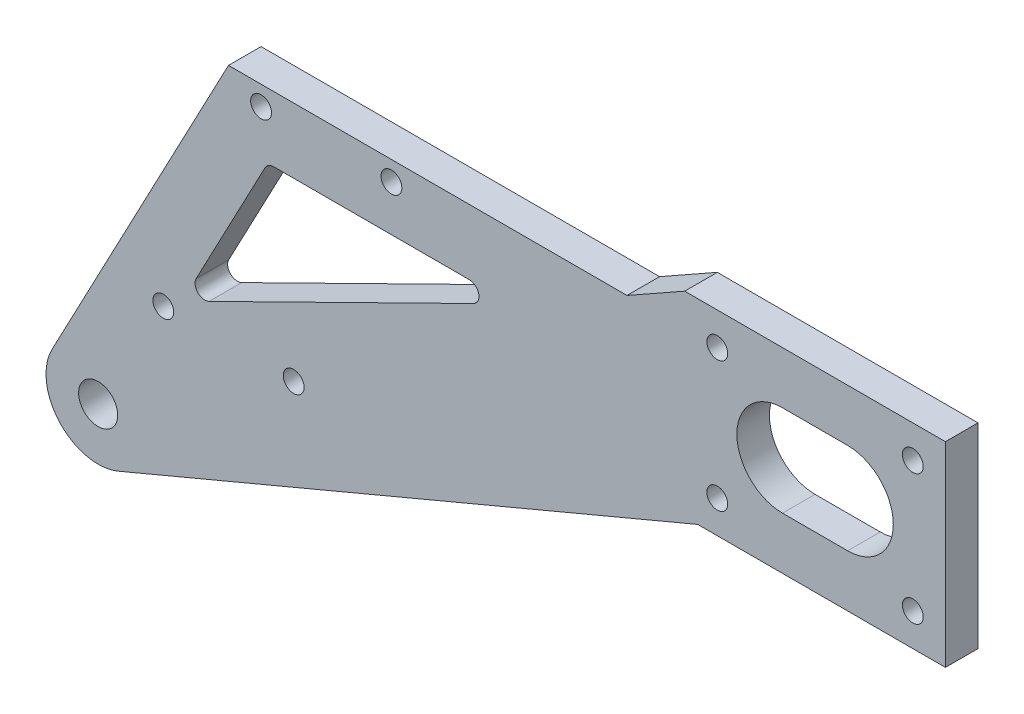
ISO-10303-21;
HEADER;
FILE_DESCRIPTION(('STEP AP214'),'2;1');
FILE_NAME('part.step','',(''),(''),'','','');
FILE_SCHEMA(('AUTOMOTIVE_DESIGN { 1 0 10303 214 1 1 1 1 }'));
ENDSEC;
DATA;
#1=APPLICATION_CONTEXT('core data for automotive mechanical design processes');
#2=APPLICATION_PROTOCOL_DEFINITION('international standard','automotive_design',2000,#1);
#3=PRODUCT_CONTEXT('',#1,'mechanical');
#4=PRODUCT('Part','Part','',(#3));
#5=PRODUCT_RELATED_PRODUCT_CATEGORY('part','',(#4));
#6=PRODUCT_DEFINITION_FORMATION('','',#4);
#7=PRODUCT_DEFINITION_CONTEXT('part definition',#1,'design');
#8=PRODUCT_DEFINITION('design','',#6,#7);
#9=PRODUCT_DEFINITION_SHAPE('','',#8);
#10=(LENGTH_UNIT() NAMED_UNIT(*) SI_UNIT(.MILLI.,.METRE.));
#11=(NAMED_UNIT(*) PLANE_ANGLE_UNIT() SI_UNIT($,.RADIAN.));
#12=(NAMED_UNIT(*) SI_UNIT($,.STERADIAN.) SOLID_ANGLE_UNIT());
#13=UNCERTAINTY_MEASURE_WITH_UNIT(LENGTH_MEASURE(1.E-05),#10,'distance_accuracy_value','');
#14=(GEOMETRIC_REPRESENTATION_CONTEXT(3) GLOBAL_UNCERTAINTY_ASSIGNED_CONTEXT((#13)) GLOBAL_UNIT_ASSIGNED_CONTEXT((#10,
#11,#12)) REPRESENTATION_CONTEXT('',''));
#15=CARTESIAN_POINT('',(0.,0.,0.));
#16=DIRECTION('',(0.,0.,1.));
#17=DIRECTION('',(1.,0.,0.));
#18=AXIS2_PLACEMENT_3D('',#15,#16,#17);
#19=CARTESIAN_POINT('',(0.,0.,5.));
#20=DIRECTION('',(0.,0.,1.));
#21=DIRECTION('',(1.,0.,0.));
#22=AXIS2_PLACEMENT_3D('',#19,#20,#21);
#23=PLANE('',#22);
#24=CARTESIAN_POINT('',(10.,18.,5.));
#25=DIRECTION('',(0.,0.,1.));
#26=DIRECTION('',(1.,0.,0.));
#27=AXIS2_PLACEMENT_3D('',#24,#25,#26);
#28=CIRCLE('',#27,1.6);
#29=CARTESIAN_POINT('',(11.6,18.,5.));
#30=VERTEX_POINT('',#29);
#31=EDGE_CURVE('E485',#30,#30,#28,.T.);
#32=ORIENTED_EDGE('',*,*,#31,.F.);
#33=EDGE_LOOP('',(#32));
#34=FACE_BOUND('',#33,.T.);
#35=CARTESIAN_POINT('',(30.,18.,5.));
#36=DIRECTION('',(0.,0.,1.));
#37=DIRECTION('',(1.,0.,0.));
#38=AXIS2_PLACEMENT_3D('',#35,#36,#37);
#39=CIRCLE('',#38,1.6);
#40=CARTESIAN_POINT('',(31.6,18.,5.));
#41=VERTEX_POINT('',#40);
#42=EDGE_CURVE('E192',#41,#41,#39,.T.);
#43=ORIENTED_EDGE('',*,*,#42,.F.);
#44=EDGE_LOOP('',(#43));
#45=FACE_BOUND('',#44,.T.);
#46=CARTESIAN_POINT('',(56.9317860296705,43.5,5.));
#47=DIRECTION('',(0.,0.,1.));
#48=DIRECTION('',(1.,0.,0.));
#49=AXIS2_PLACEMENT_3D('',#46,#47,#48);
#50=CIRCLE('',#49,1.50000000000001);
#51=CARTESIAN_POINT('',(57.5951320607567,42.1546479854543,5.));
#52=VERTEX_POINT('',#51);
#53=CARTESIAN_POINT('',(56.9317860296705,45.,5.));
#54=VERTEX_POINT('',#53);
#55=EDGE_CURVE('E54',#52,#54,#50,.T.);
#56=ORIENTED_EDGE('',*,*,#55,.F.);
#57=DIRECTION('',(0.896901343030464,0.442230687390812,0.));
#58=VECTOR('',#57,1.);
#59=CARTESIAN_POINT('',(17.0325312009098,22.1546479854543,5.));
#60=LINE('',#59,#58);
#61=CARTESIAN_POINT('',(17.0325312009098,22.1546479854543,5.));
#62=VERTEX_POINT('',#61);
#63=EDGE_CURVE('E186',#62,#52,#60,.T.);
#64=ORIENTED_EDGE('',*,*,#63,.F.);
#65=CARTESIAN_POINT('',(16.3691851698236,23.5,5.));
#66=DIRECTION('',(0.,0.,1.));
#67=DIRECTION('',(1.,0.,0.));
#68=AXIS2_PLACEMENT_3D('',#65,#66,#67);
#69=CIRCLE('',#68,1.5);
#70=CARTESIAN_POINT('',(15.0428009644484,24.2005033474091,5.));
#71=VERTEX_POINT('',#70);
#72=EDGE_CURVE('E189',#71,#62,#69,.T.);
#73=ORIENTED_EDGE('',*,*,#72,.F.);
#74=DIRECTION('',(-0.46700223160609,-0.884256136916748,0.));
#75=VECTOR('',#74,1.);
#76=CARTESIAN_POINT('',(25.6054018242954,44.2005033474091,5.));
#77=LINE('',#76,#75);
#78=CARTESIAN_POINT('',(25.6054018242954,44.2005033474091,5.));
#79=VERTEX_POINT('',#78);
#80=EDGE_CURVE('E209',#79,#71,#77,.T.);
#81=ORIENTED_EDGE('',*,*,#80,.F.);
#82=CARTESIAN_POINT('',(26.9317860296705,43.5,5.));
#83=DIRECTION('',(0.,0.,1.));
#84=DIRECTION('',(-1.,0.,0.));
#85=AXIS2_PLACEMENT_3D('',#82,#83,#84);
#86=CIRCLE('',#85,1.5);
#87=CARTESIAN_POINT('',(26.9317860296705,45.,5.));
#88=VERTEX_POINT('',#87);
#89=EDGE_CURVE('E206',#88,#79,#86,.T.);
#90=ORIENTED_EDGE('',*,*,#89,.F.);
#91=DIRECTION('',(-1.,0.,0.));
#92=VECTOR('',#91,1.);
#93=CARTESIAN_POINT('',(56.9317860296705,45.,5.));
#94=LINE('',#93,#92);
#95=EDGE_CURVE('E203',#54,#88,#94,.T.);
#96=ORIENTED_EDGE('',*,*,#95,.F.);
#97=EDGE_LOOP('',(#56,#64,#73,#81,#90,#96));
#98=FACE_BOUND('',#97,.T.);
#99=CARTESIAN_POINT('',(105.,45.,5.));
#100=DIRECTION('',(0.,0.,1.));
#101=DIRECTION('',(1.,0.,0.));
#102=AXIS2_PLACEMENT_3D('',#99,#100,#101);
#103=CIRCLE('',#102,7.);
#104=CARTESIAN_POINT('',(105.,52.,5.));
#105=VERTEX_POINT('',#104);
#106=CARTESIAN_POINT('',(105.,38.,5.));
#107=VERTEX_POINT('',#106);
#108=EDGE_CURVE('E62',#105,#107,#103,.T.);
#109=ORIENTED_EDGE('',*,*,#108,.F.);
#110=DIRECTION('',(-1.,0.,0.));
#111=VECTOR('',#110,1.);
#112=CARTESIAN_POINT('',(105.,52.,5.));
#113=LINE('',#112,#111);
#114=CARTESIAN_POINT('',(115.,52.,5.));
#115=VERTEX_POINT('',#114);
#116=EDGE_CURVE('E228',#115,#105,#113,.T.);
#117=ORIENTED_EDGE('',*,*,#116,.F.);
#118=CARTESIAN_POINT('',(115.,45.,5.));
#119=DIRECTION('',(0.,0.,1.));
#120=DIRECTION('',(1.,0.,0.));
#121=AXIS2_PLACEMENT_3D('',#118,#119,#120);
#122=CIRCLE('',#121,7.);
#123=CARTESIAN_POINT('',(115.,38.,5.));
#124=VERTEX_POINT('',#123);
#125=EDGE_CURVE('E243',#124,#115,#122,.T.);
#126=ORIENTED_EDGE('',*,*,#125,.F.);
#127=DIRECTION('',(1.,0.,0.));
#128=VECTOR('',#127,1.);
#129=CARTESIAN_POINT('',(105.,38.,5.));
#130=LINE('',#129,#128);
#131=EDGE_CURVE('E239',#107,#124,#130,.T.);
#132=ORIENTED_EDGE('',*,*,#131,.F.);
#133=EDGE_LOOP('',(#109,#117,#126,#132));
#134=FACE_BOUND('',#133,.T.);
#135=DIRECTION('',(-0.46700223160609,-0.884256136916748,0.));
#136=VECTOR('',#135,1.);
#137=CARTESIAN_POINT('',(-7.07404909533399,3.73601785284872,5.));
#138=LINE('',#137,#136);
#139=CARTESIAN_POINT('',(20.,55.,5.));
#140=VERTEX_POINT('',#139);
#141=CARTESIAN_POINT('',(-7.07404909533399,3.73601785284872,5.));
#142=VERTEX_POINT('',#141);
#143=EDGE_CURVE('E216',#140,#142,#138,.T.);
#144=ORIENTED_EDGE('',*,*,#143,.T.);
#145=CARTESIAN_POINT('',(0.,0.,5.));
#146=DIRECTION('',(0.,0.,1.));
#147=DIRECTION('',(1.,0.,0.));
#148=AXIS2_PLACEMENT_3D('',#145,#146,#147);
#149=CIRCLE('',#148,8.);
#150=CARTESIAN_POINT('',(3.10046580802895,-7.37476181128878,5.));
#151=VERTEX_POINT('',#150);
#152=EDGE_CURVE('E314',#142,#151,#149,.T.);
#153=ORIENTED_EDGE('',*,*,#152,.T.);
#154=DIRECTION('',(0.921845226411098,0.387558226003619,0.));
#155=VECTOR('',#154,1.);
#156=CARTESIAN_POINT('',(92.,30.,5.));
#157=LINE('',#156,#155);
#158=CARTESIAN_POINT('',(92.,30.,5.));
#159=VERTEX_POINT('',#158);
#160=EDGE_CURVE('E316',#151,#159,#157,.T.);
#161=ORIENTED_EDGE('',*,*,#160,.T.);
#162=DIRECTION('',(1.,0.,0.));
#163=VECTOR('',#162,1.);
#164=CARTESIAN_POINT('',(92.,30.,5.));
#165=LINE('',#164,#163);
#166=CARTESIAN_POINT('',(130.,30.,5.));
#167=VERTEX_POINT('',#166);
#168=EDGE_CURVE('E319',#159,#167,#165,.T.);
#169=ORIENTED_EDGE('',*,*,#168,.T.);
#170=DIRECTION('',(0.,1.,0.));
#171=VECTOR('',#170,1.);
#172=CARTESIAN_POINT('',(130.,60.,5.));
#173=LINE('',#172,#171);
#174=CARTESIAN_POINT('',(130.,60.,5.));
#175=VERTEX_POINT('',#174);
#176=EDGE_CURVE('E321',#167,#175,#173,.T.);
#177=ORIENTED_EDGE('',*,*,#176,.T.);
#178=DIRECTION('',(-1.,0.,0.));
#179=VECTOR('',#178,1.);
#180=CARTESIAN_POINT('',(90.,60.,5.));
#181=LINE('',#180,#179);
#182=CARTESIAN_POINT('',(90.,60.,5.));
#183=VERTEX_POINT('',#182);
#184=EDGE_CURVE('E323',#175,#183,#181,.T.);
#185=ORIENTED_EDGE('',*,*,#184,.T.);
#186=DIRECTION('',(-0.870797121650983,-0.4916425255451,0.));
#187=VECTOR('',#186,1.);
#188=CARTESIAN_POINT('',(-3.9331402043608,6.96637697320786,5.));
#189=LINE('',#188,#187);
#190=CARTESIAN_POINT('',(81.1440012162749,55.,5.));
#191=VERTEX_POINT('',#190);
#192=EDGE_CURVE('E325',#183,#191,#189,.T.);
#193=ORIENTED_EDGE('',*,*,#192,.T.);
#194=DIRECTION('',(-1.,0.,0.));
#195=VECTOR('',#194,1.);
#196=CARTESIAN_POINT('',(81.1440012162749,55.,5.));
#197=LINE('',#196,#195);
#198=EDGE_CURVE('E264',#191,#140,#197,.T.);
#199=ORIENTED_EDGE('',*,*,#198,.T.);
#200=EDGE_LOOP('',(#144,#153,#161,#169,#177,#185,#193,#199));
#201=FACE_BOUND('',#200,.T.);
#202=CARTESIAN_POINT('',(25.,52.,5.));
#203=DIRECTION('',(0.,0.,1.));
#204=DIRECTION('',(1.,0.,0.));
#205=AXIS2_PLACEMENT_3D('',#202,#203,#204);
#206=CIRCLE('',#205,1.6);
#207=CARTESIAN_POINT('',(26.6,52.,5.));
#208=VERTEX_POINT('',#207);
#209=EDGE_CURVE('E265',#208,#208,#206,.T.);
#210=ORIENTED_EDGE('',*,*,#209,.F.);
#211=EDGE_LOOP('',(#210));
#212=FACE_BOUND('',#211,.T.);
#213=CARTESIAN_POINT('',(45.,52.,5.));
#214=DIRECTION('',(0.,0.,1.));
#215=DIRECTION('',(1.,0.,0.));
#216=AXIS2_PLACEMENT_3D('',#213,#214,#215);
#217=CIRCLE('',#216,1.6);
#218=CARTESIAN_POINT('',(46.6,52.,5.));
#219=VERTEX_POINT('',#218);
#220=EDGE_CURVE('E256',#219,#219,#217,.T.);
#221=ORIENTED_EDGE('',*,*,#220,.F.);
#222=EDGE_LOOP('',(#221));
#223=FACE_BOUND('',#222,.T.);
#224=CARTESIAN_POINT('',(125.,35.,5.));
#225=DIRECTION('',(0.,0.,1.));
#226=DIRECTION('',(1.,0.,0.));
#227=AXIS2_PLACEMENT_3D('',#224,#225,#226);
#228=CIRCLE('',#227,1.59999999999999);
#229=CARTESIAN_POINT('',(126.6,35.,5.));
#230=VERTEX_POINT('',#229);
#231=EDGE_CURVE('E290',#230,#230,#228,.T.);
#232=ORIENTED_EDGE('',*,*,#231,.F.);
#233=EDGE_LOOP('',(#232));
#234=FACE_BOUND('',#233,.T.);
#235=CARTESIAN_POINT('',(125.,55.,5.));
#236=DIRECTION('',(0.,0.,1.));
#237=DIRECTION('',(1.,0.,0.));
#238=AXIS2_PLACEMENT_3D('',#235,#236,#237);
#239=CIRCLE('',#238,1.59999999999999);
#240=CARTESIAN_POINT('',(126.6,55.,5.));
#241=VERTEX_POINT('',#240);
#242=EDGE_CURVE('E302',#241,#241,#239,.T.);
#243=ORIENTED_EDGE('',*,*,#242,.F.);
#244=EDGE_LOOP('',(#243));
#245=FACE_BOUND('',#244,.T.);
#246=CARTESIAN_POINT('',(0.,0.,5.));
#247=DIRECTION('',(0.,0.,1.));
#248=DIRECTION('',(1.,0.,0.));
#249=AXIS2_PLACEMENT_3D('',#246,#247,#248);
#250=CIRCLE('',#249,3.);
#251=CARTESIAN_POINT('',(3.,0.,5.));
#252=VERTEX_POINT('',#251);
#253=EDGE_CURVE('E308',#252,#252,#250,.T.);
#254=ORIENTED_EDGE('',*,*,#253,.F.);
#255=EDGE_LOOP('',(#254));
#256=FACE_BOUND('',#255,.T.);
#257=CARTESIAN_POINT('',(95.,55.,5.));
#258=DIRECTION('',(0.,0.,1.));
#259=DIRECTION('',(1.,0.,0.));
#260=AXIS2_PLACEMENT_3D('',#257,#258,#259);
#261=CIRCLE('',#260,1.60000000000001);
#262=CARTESIAN_POINT('',(96.6,55.,5.));
#263=VERTEX_POINT('',#262);
#264=EDGE_CURVE('E296',#263,#263,#261,.T.);
#265=ORIENTED_EDGE('',*,*,#264,.F.);
#266=EDGE_LOOP('',(#265));
#267=FACE_BOUND('',#266,.T.);
#268=CARTESIAN_POINT('',(95.,35.,5.));
#269=DIRECTION('',(0.,0.,1.));
#270=DIRECTION('',(1.,0.,0.));
#271=AXIS2_PLACEMENT_3D('',#268,#269,#270);
#272=CIRCLE('',#271,1.60000000000001);
#273=CARTESIAN_POINT('',(96.6,35.,5.));
#274=VERTEX_POINT('',#273);
#275=EDGE_CURVE('E284',#274,#274,#272,.T.);
#276=ORIENTED_EDGE('',*,*,#275,.F.);
#277=EDGE_LOOP('',(#276));
#278=FACE_BOUND('',#277,.T.);
#279=ADVANCED_FACE('F39',(#34,#45,#98,#134,#201,#212,#223,#234,#245,#256,#267,#278),#23,.T.);
#280=CARTESIAN_POINT('',(0.,0.,0.));
#281=DIRECTION('',(0.,0.,1.));
#282=DIRECTION('',(1.,0.,0.));
#283=AXIS2_PLACEMENT_3D('',#280,#281,#282);
#284=PLANE('',#283);
#285=CARTESIAN_POINT('',(10.,18.,0.));
#286=DIRECTION('',(0.,0.,1.));
#287=DIRECTION('',(1.,0.,0.));
#288=AXIS2_PLACEMENT_3D('',#285,#286,#287);
#289=CIRCLE('',#288,1.6);
#290=CARTESIAN_POINT('',(11.6,18.,0.));
#291=VERTEX_POINT('',#290);
#292=EDGE_CURVE('E240',#291,#291,#289,.T.);
#293=ORIENTED_EDGE('',*,*,#292,.T.);
#294=EDGE_LOOP('',(#293));
#295=FACE_BOUND('',#294,.T.);
#296=CARTESIAN_POINT('',(30.,18.,0.));
#297=DIRECTION('',(0.,0.,1.));
#298=DIRECTION('',(1.,0.,0.));
#299=AXIS2_PLACEMENT_3D('',#296,#297,#298);
#300=CIRCLE('',#299,1.6);
#301=CARTESIAN_POINT('',(31.6,18.,0.));
#302=VERTEX_POINT('',#301);
#303=EDGE_CURVE('E486',#302,#302,#300,.T.);
#304=ORIENTED_EDGE('',*,*,#303,.T.);
#305=EDGE_LOOP('',(#304));
#306=FACE_BOUND('',#305,.T.);
#307=DIRECTION('',(0.896901343030464,0.442230687390812,0.));
#308=VECTOR('',#307,1.);
#309=CARTESIAN_POINT('',(17.0325312009098,22.1546479854543,0.));
#310=LINE('',#309,#308);
#311=CARTESIAN_POINT('',(17.0325312009098,22.1546479854543,0.));
#312=VERTEX_POINT('',#311);
#313=CARTESIAN_POINT('',(57.5951320607567,42.1546479854543,0.));
#314=VERTEX_POINT('',#313);
#315=EDGE_CURVE('E172',#312,#314,#310,.T.);
#316=ORIENTED_EDGE('',*,*,#315,.T.);
#317=CARTESIAN_POINT('',(56.9317860296705,43.5,0.));
#318=DIRECTION('',(0.,0.,1.));
#319=DIRECTION('',(1.,0.,0.));
#320=AXIS2_PLACEMENT_3D('',#317,#318,#319);
#321=CIRCLE('',#320,1.50000000000001);
#322=CARTESIAN_POINT('',(56.9317860296705,45.,0.));
#323=VERTEX_POINT('',#322);
#324=EDGE_CURVE('E166',#314,#323,#321,.T.);
#325=ORIENTED_EDGE('',*,*,#324,.T.);
#326=DIRECTION('',(-1.,0.,0.));
#327=VECTOR('',#326,1.);
#328=CARTESIAN_POINT('',(56.9317860296705,45.,0.));
#329=LINE('',#328,#327);
#330=CARTESIAN_POINT('',(26.9317860296705,45.,0.));
#331=VERTEX_POINT('',#330);
#332=EDGE_CURVE('E176',#323,#331,#329,.T.);
#333=ORIENTED_EDGE('',*,*,#332,.T.);
#334=CARTESIAN_POINT('',(26.9317860296705,43.5,0.));
#335=DIRECTION('',(0.,0.,1.));
#336=DIRECTION('',(-1.,0.,0.));
#337=AXIS2_PLACEMENT_3D('',#334,#335,#336);
#338=CIRCLE('',#337,1.5);
#339=CARTESIAN_POINT('',(25.6054018242954,44.2005033474091,0.));
#340=VERTEX_POINT('',#339);
#341=EDGE_CURVE('E180',#331,#340,#338,.T.);
#342=ORIENTED_EDGE('',*,*,#341,.T.);
#343=DIRECTION('',(-0.46700223160609,-0.884256136916748,0.));
#344=VECTOR('',#343,1.);
#345=CARTESIAN_POINT('',(25.6054018242954,44.2005033474091,0.));
#346=LINE('',#345,#344);
#347=CARTESIAN_POINT('',(15.0428009644484,24.2005033474091,0.));
#348=VERTEX_POINT('',#347);
#349=EDGE_CURVE('E196',#340,#348,#346,.T.);
#350=ORIENTED_EDGE('',*,*,#349,.T.);
#351=CARTESIAN_POINT('',(16.3691851698236,23.5,0.));
#352=DIRECTION('',(0.,0.,1.));
#353=DIRECTION('',(1.,0.,0.));
#354=AXIS2_PLACEMENT_3D('',#351,#352,#353);
#355=CIRCLE('',#354,1.5);
#356=EDGE_CURVE('E199',#348,#312,#355,.T.);
#357=ORIENTED_EDGE('',*,*,#356,.T.);
#358=EDGE_LOOP('',(#316,#325,#333,#342,#350,#357));
#359=FACE_BOUND('',#358,.T.);
#360=DIRECTION('',(-1.,0.,0.));
#361=VECTOR('',#360,1.);
#362=CARTESIAN_POINT('',(105.,52.,0.));
#363=LINE('',#362,#361);
#364=CARTESIAN_POINT('',(115.,52.,0.));
#365=VERTEX_POINT('',#364);
#366=CARTESIAN_POINT('',(105.,52.,0.));
#367=VERTEX_POINT('',#366);
#368=EDGE_CURVE('E234',#365,#367,#363,.T.);
#369=ORIENTED_EDGE('',*,*,#368,.T.);
#370=CARTESIAN_POINT('',(105.,45.,0.));
#371=DIRECTION('',(0.,0.,1.));
#372=DIRECTION('',(1.,0.,0.));
#373=AXIS2_PLACEMENT_3D('',#370,#371,#372);
#374=CIRCLE('',#373,7.);
#375=CARTESIAN_POINT('',(105.,38.,0.));
#376=VERTEX_POINT('',#375);
#377=EDGE_CURVE('E224',#367,#376,#374,.T.);
#378=ORIENTED_EDGE('',*,*,#377,.T.);
#379=DIRECTION('',(1.,0.,0.));
#380=VECTOR('',#379,1.);
#381=CARTESIAN_POINT('',(105.,38.,0.));
#382=LINE('',#381,#380);
#383=CARTESIAN_POINT('',(115.,38.,0.));
#384=VERTEX_POINT('',#383);
#385=EDGE_CURVE('E227',#376,#384,#382,.T.);
#386=ORIENTED_EDGE('',*,*,#385,.T.);
#387=CARTESIAN_POINT('',(115.,45.,0.));
#388=DIRECTION('',(0.,0.,1.));
#389=DIRECTION('',(1.,0.,0.));
#390=AXIS2_PLACEMENT_3D('',#387,#388,#389);
#391=CIRCLE('',#390,7.);
#392=EDGE_CURVE('E231',#384,#365,#391,.T.);
#393=ORIENTED_EDGE('',*,*,#392,.T.);
#394=EDGE_LOOP('',(#369,#378,#386,#393));
#395=FACE_BOUND('',#394,.T.);
#396=CARTESIAN_POINT('',(0.,0.,0.));
#397=DIRECTION('',(0.,0.,1.));
#398=DIRECTION('',(1.,0.,0.));
#399=AXIS2_PLACEMENT_3D('',#396,#397,#398);
#400=CIRCLE('',#399,8.);
#401=CARTESIAN_POINT('',(-7.07404909533399,3.73601785284872,0.));
#402=VERTEX_POINT('',#401);
#403=CARTESIAN_POINT('',(3.10046580802895,-7.37476181128878,0.));
#404=VERTEX_POINT('',#403);
#405=EDGE_CURVE('E311',#402,#404,#400,.T.);
#406=ORIENTED_EDGE('',*,*,#405,.F.);
#407=DIRECTION('',(0.46700223160609,0.884256136916749,0.));
#408=VECTOR('',#407,1.);
#409=CARTESIAN_POINT('',(-7.07404909533399,3.73601785284872,0.));
#410=LINE('',#409,#408);
#411=CARTESIAN_POINT('',(20.,55.,0.));
#412=VERTEX_POINT('',#411);
#413=EDGE_CURVE('E254',#402,#412,#410,.T.);
#414=ORIENTED_EDGE('',*,*,#413,.T.);
#415=DIRECTION('',(1.,0.,0.));
#416=VECTOR('',#415,1.);
#417=CARTESIAN_POINT('',(81.1440012162749,55.,0.));
#418=LINE('',#417,#416);
#419=CARTESIAN_POINT('',(81.1440012162749,55.,0.));
#420=VERTEX_POINT('',#419);
#421=EDGE_CURVE('E279',#412,#420,#418,.T.);
#422=ORIENTED_EDGE('',*,*,#421,.T.);
#423=DIRECTION('',(-0.870797121650983,-0.4916425255451,0.));
#424=VECTOR('',#423,1.);
#425=CARTESIAN_POINT('',(-3.9331402043608,6.96637697320786,0.));
#426=LINE('',#425,#424);
#427=CARTESIAN_POINT('',(90.,60.,0.));
#428=VERTEX_POINT('',#427);
#429=EDGE_CURVE('E317',#428,#420,#426,.T.);
#430=ORIENTED_EDGE('',*,*,#429,.F.);
#431=DIRECTION('',(-1.,0.,0.));
#432=VECTOR('',#431,1.);
#433=CARTESIAN_POINT('',(90.,60.,0.));
#434=LINE('',#433,#432);
#435=CARTESIAN_POINT('',(130.,60.,0.));
#436=VERTEX_POINT('',#435);
#437=EDGE_CURVE('E336',#436,#428,#434,.T.);
#438=ORIENTED_EDGE('',*,*,#437,.F.);
#439=DIRECTION('',(0.,1.,0.));
#440=VECTOR('',#439,1.);
#441=CARTESIAN_POINT('',(130.,60.,0.));
#442=LINE('',#441,#440);
#443=CARTESIAN_POINT('',(130.,30.,0.));
#444=VERTEX_POINT('',#443);
#445=EDGE_CURVE('E334',#444,#436,#442,.T.);
#446=ORIENTED_EDGE('',*,*,#445,.F.);
#447=DIRECTION('',(1.,0.,0.));
#448=VECTOR('',#447,1.);
#449=CARTESIAN_POINT('',(92.,30.,0.));
#450=LINE('',#449,#448);
#451=CARTESIAN_POINT('',(92.,30.,0.));
#452=VERTEX_POINT('',#451);
#453=EDGE_CURVE('E332',#452,#444,#450,.T.);
#454=ORIENTED_EDGE('',*,*,#453,.F.);
#455=DIRECTION('',(0.921845226411098,0.387558226003619,0.));
#456=VECTOR('',#455,1.);
#457=CARTESIAN_POINT('',(92.,30.,0.));
#458=LINE('',#457,#456);
#459=EDGE_CURVE('E330',#404,#452,#458,.T.);
#460=ORIENTED_EDGE('',*,*,#459,.F.);
#461=EDGE_LOOP('',(#406,#414,#422,#430,#438,#446,#454,#460));
#462=FACE_BOUND('',#461,.T.);
#463=CARTESIAN_POINT('',(25.,52.,0.));
#464=DIRECTION('',(0.,0.,1.));
#465=DIRECTION('',(1.,0.,0.));
#466=AXIS2_PLACEMENT_3D('',#463,#464,#465);
#467=CIRCLE('',#466,1.6);
#468=CARTESIAN_POINT('',(26.6,52.,0.));
#469=VERTEX_POINT('',#468);
#470=EDGE_CURVE('E261',#469,#469,#467,.T.);
#471=ORIENTED_EDGE('',*,*,#470,.T.);
#472=EDGE_LOOP('',(#471));
#473=FACE_BOUND('',#472,.T.);
#474=CARTESIAN_POINT('',(45.,52.,0.));
#475=DIRECTION('',(0.,0.,1.));
#476=DIRECTION('',(1.,0.,0.));
#477=AXIS2_PLACEMENT_3D('',#474,#475,#476);
#478=CIRCLE('',#477,1.6);
#479=CARTESIAN_POINT('',(46.6,52.,0.));
#480=VERTEX_POINT('',#479);
#481=EDGE_CURVE('E268',#480,#480,#478,.T.);
#482=ORIENTED_EDGE('',*,*,#481,.T.);
#483=EDGE_LOOP('',(#482));
#484=FACE_BOUND('',#483,.T.);
#485=CARTESIAN_POINT('',(0.,0.,0.));
#486=DIRECTION('',(0.,0.,1.));
#487=DIRECTION('',(1.,0.,0.));
#488=AXIS2_PLACEMENT_3D('',#485,#486,#487);
#489=CIRCLE('',#488,3.);
#490=CARTESIAN_POINT('',(3.,0.,0.));
#491=VERTEX_POINT('',#490);
#492=EDGE_CURVE('E305',#491,#491,#489,.T.);
#493=ORIENTED_EDGE('',*,*,#492,.T.);
#494=EDGE_LOOP('',(#493));
#495=FACE_BOUND('',#494,.T.);
#496=CARTESIAN_POINT('',(125.,55.,0.));
#497=DIRECTION('',(0.,0.,1.));
#498=DIRECTION('',(1.,0.,0.));
#499=AXIS2_PLACEMENT_3D('',#496,#497,#498);
#500=CIRCLE('',#499,1.59999999999999);
#501=CARTESIAN_POINT('',(126.6,55.,0.));
#502=VERTEX_POINT('',#501);
#503=EDGE_CURVE('E299',#502,#502,#500,.T.);
#504=ORIENTED_EDGE('',*,*,#503,.T.);
#505=EDGE_LOOP('',(#504));
#506=FACE_BOUND('',#505,.T.);
#507=CARTESIAN_POINT('',(95.,55.,0.));
#508=DIRECTION('',(0.,0.,1.));
#509=DIRECTION('',(1.,0.,0.));
#510=AXIS2_PLACEMENT_3D('',#507,#508,#509);
#511=CIRCLE('',#510,1.60000000000001);
#512=CARTESIAN_POINT('',(96.6,55.,0.));
#513=VERTEX_POINT('',#512);
#514=EDGE_CURVE('E293',#513,#513,#511,.T.);
#515=ORIENTED_EDGE('',*,*,#514,.T.);
#516=EDGE_LOOP('',(#515));
#517=FACE_BOUND('',#516,.T.);
#518=CARTESIAN_POINT('',(125.,35.,0.));
#519=DIRECTION('',(0.,0.,1.));
#520=DIRECTION('',(1.,0.,0.));
#521=AXIS2_PLACEMENT_3D('',#518,#519,#520);
#522=CIRCLE('',#521,1.59999999999999);
#523=CARTESIAN_POINT('',(126.6,35.,0.));
#524=VERTEX_POINT('',#523);
#525=EDGE_CURVE('E287',#524,#524,#522,.T.);
#526=ORIENTED_EDGE('',*,*,#525,.T.);
#527=EDGE_LOOP('',(#526));
#528=FACE_BOUND('',#527,.T.);
#529=CARTESIAN_POINT('',(95.,35.,0.));
#530=DIRECTION('',(0.,0.,1.));
#531=DIRECTION('',(1.,0.,0.));
#532=AXIS2_PLACEMENT_3D('',#529,#530,#531);
#533=CIRCLE('',#532,1.60000000000001);
#534=CARTESIAN_POINT('',(96.6,35.,0.));
#535=VERTEX_POINT('',#534);
#536=EDGE_CURVE('E283',#535,#535,#533,.T.);
#537=ORIENTED_EDGE('',*,*,#536,.T.);
#538=EDGE_LOOP('',(#537));
#539=FACE_BOUND('',#538,.T.);
#540=ADVANCED_FACE('F182',(#295,#306,#359,#395,#462,#473,#484,#495,#506,#517,#528,#539),#284,.F.);
#541=CARTESIAN_POINT('',(0.,0.,5.));
#542=DIRECTION('',(0.,0.,-1.));
#543=DIRECTION('',(-1.,0.,0.));
#544=AXIS2_PLACEMENT_3D('',#541,#542,#543);
#545=CYLINDRICAL_SURFACE('',#544,8.);
#546=ORIENTED_EDGE('',*,*,#152,.F.);
#547=DIRECTION('',(0.,0.,1.));
#548=VECTOR('',#547,1.);
#549=CARTESIAN_POINT('',(-7.07404909533399,3.73601785284872,-57.974132162543));
#550=LINE('',#549,#548);
#551=EDGE_CURVE('E257',#402,#142,#550,.T.);
#552=ORIENTED_EDGE('',*,*,#551,.F.);
#553=ORIENTED_EDGE('',*,*,#405,.T.);
#554=DIRECTION('',(0.,0.,-1.));
#555=VECTOR('',#554,1.);
#556=CARTESIAN_POINT('',(3.10046580802895,-7.37476181128878,5.));
#557=LINE('',#556,#555);
#558=EDGE_CURVE('E11',#151,#404,#557,.T.);
#559=ORIENTED_EDGE('',*,*,#558,.F.);
#560=EDGE_LOOP('',(#546,#552,#553,#559));
#561=FACE_BOUND('',#560,.T.);
#562=ADVANCED_FACE('F41',(#561),#545,.T.);
#563=CARTESIAN_POINT('',(92.,30.,5.));
#564=DIRECTION('',(-0.387558226003619,0.921845226411098,0.));
#565=DIRECTION('',(-0.921845226411098,-0.387558226003619,0.));
#566=AXIS2_PLACEMENT_3D('',#563,#564,#565);
#567=PLANE('',#566);
#568=ORIENTED_EDGE('',*,*,#459,.T.);
#569=DIRECTION('',(0.,0.,-1.));
#570=VECTOR('',#569,1.);
#571=CARTESIAN_POINT('',(92.,30.,5.));
#572=LINE('',#571,#570);
#573=EDGE_CURVE('E47',#159,#452,#572,.T.);
#574=ORIENTED_EDGE('',*,*,#573,.F.);
#575=ORIENTED_EDGE('',*,*,#160,.F.);
#576=ORIENTED_EDGE('',*,*,#558,.T.);
#577=EDGE_LOOP('',(#568,#574,#575,#576));
#578=FACE_BOUND('',#577,.T.);
#579=ADVANCED_FACE('F376',(#578),#567,.F.);
#580=CARTESIAN_POINT('',(92.,30.,5.));
#581=DIRECTION('',(0.,1.,0.));
#582=DIRECTION('',(0.,0.,1.));
#583=AXIS2_PLACEMENT_3D('',#580,#581,#582);
#584=PLANE('',#583);
#585=ORIENTED_EDGE('',*,*,#453,.T.);
#586=DIRECTION('',(0.,0.,-1.));
#587=VECTOR('',#586,1.);
#588=CARTESIAN_POINT('',(130.,30.,5.));
#589=LINE('',#588,#587);
#590=EDGE_CURVE('E344',#167,#444,#589,.T.);
#591=ORIENTED_EDGE('',*,*,#590,.F.);
#592=ORIENTED_EDGE('',*,*,#168,.F.);
#593=ORIENTED_EDGE('',*,*,#573,.T.);
#594=EDGE_LOOP('',(#585,#591,#592,#593));
#595=FACE_BOUND('',#594,.T.);
#596=ADVANCED_FACE('F351',(#595),#584,.F.);
#597=CARTESIAN_POINT('',(130.,60.,5.));
#598=DIRECTION('',(-1.,0.,0.));
#599=DIRECTION('',(0.,-1.,0.));
#600=AXIS2_PLACEMENT_3D('',#597,#598,#599);
#601=PLANE('',#600);
#602=ORIENTED_EDGE('',*,*,#445,.T.);
#603=DIRECTION('',(0.,0.,-1.));
#604=VECTOR('',#603,1.);
#605=CARTESIAN_POINT('',(130.,60.,5.));
#606=LINE('',#605,#604);
#607=EDGE_CURVE('E341',#175,#436,#606,.T.);
#608=ORIENTED_EDGE('',*,*,#607,.F.);
#609=ORIENTED_EDGE('',*,*,#176,.F.);
#610=ORIENTED_EDGE('',*,*,#590,.T.);
#611=EDGE_LOOP('',(#602,#608,#609,#610));
#612=FACE_BOUND('',#611,.T.);
#613=ADVANCED_FACE('F364',(#612),#601,.F.);
#614=CARTESIAN_POINT('',(90.,60.,5.));
#615=DIRECTION('',(0.,-1.,0.));
#616=DIRECTION('',(0.,0.,-1.));
#617=AXIS2_PLACEMENT_3D('',#614,#615,#616);
#618=PLANE('',#617);
#619=ORIENTED_EDGE('',*,*,#437,.T.);
#620=DIRECTION('',(0.,0.,-1.));
#621=VECTOR('',#620,1.);
#622=CARTESIAN_POINT('',(90.,60.,5.));
#623=LINE('',#622,#621);
#624=EDGE_CURVE('E328',#183,#428,#623,.T.);
#625=ORIENTED_EDGE('',*,*,#624,.F.);
#626=ORIENTED_EDGE('',*,*,#184,.F.);
#627=ORIENTED_EDGE('',*,*,#607,.T.);
#628=EDGE_LOOP('',(#619,#625,#626,#627));
#629=FACE_BOUND('',#628,.T.);
#630=ADVANCED_FACE('F368',(#629),#618,.F.);
#631=CARTESIAN_POINT('',(-3.9331402043608,6.96637697320786,5.));
#632=DIRECTION('',(0.4916425255451,-0.870797121650983,0.));
#633=DIRECTION('',(0.870797121650983,0.4916425255451,0.));
#634=AXIS2_PLACEMENT_3D('',#631,#632,#633);
#635=PLANE('',#634);
#636=ORIENTED_EDGE('',*,*,#429,.T.);
#637=DIRECTION('',(0.,0.,1.));
#638=VECTOR('',#637,1.);
#639=CARTESIAN_POINT('',(81.1440012162749,55.,-70.2161269209863));
#640=LINE('',#639,#638);
#641=EDGE_CURVE('E275',#420,#191,#640,.T.);
#642=ORIENTED_EDGE('',*,*,#641,.T.);
#643=ORIENTED_EDGE('',*,*,#192,.F.);
#644=ORIENTED_EDGE('',*,*,#624,.T.);
#645=EDGE_LOOP('',(#636,#642,#643,#644));
#646=FACE_BOUND('',#645,.T.);
#647=ADVANCED_FACE('F387',(#646),#635,.F.);
#648=CARTESIAN_POINT('',(0.,0.,5.));
#649=DIRECTION('',(0.,0.,-1.));
#650=DIRECTION('',(-1.,0.,0.));
#651=AXIS2_PLACEMENT_3D('',#648,#649,#650);
#652=CYLINDRICAL_SURFACE('',#651,3.);
#653=ORIENTED_EDGE('',*,*,#253,.T.);
#654=EDGE_LOOP('',(#653));
#655=FACE_BOUND('',#654,.T.);
#656=ORIENTED_EDGE('',*,*,#492,.F.);
#657=EDGE_LOOP('',(#656));
#658=FACE_BOUND('',#657,.T.);
#659=ADVANCED_FACE('F389',(#655,#658),#652,.F.);
#660=CARTESIAN_POINT('',(125.,55.,5.));
#661=DIRECTION('',(0.,0.,-1.));
#662=DIRECTION('',(-1.,0.,0.));
#663=AXIS2_PLACEMENT_3D('',#660,#661,#662);
#664=CYLINDRICAL_SURFACE('',#663,1.59999999999999);
#665=ORIENTED_EDGE('',*,*,#242,.T.);
#666=EDGE_LOOP('',(#665));
#667=FACE_BOUND('',#666,.T.);
#668=ORIENTED_EDGE('',*,*,#503,.F.);
#669=EDGE_LOOP('',(#668));
#670=FACE_BOUND('',#669,.T.);
#671=ADVANCED_FACE('F396',(#667,#670),#664,.F.);
#672=CARTESIAN_POINT('',(95.,55.,5.));
#673=DIRECTION('',(0.,0.,-1.));
#674=DIRECTION('',(-1.,0.,0.));
#675=AXIS2_PLACEMENT_3D('',#672,#673,#674);
#676=CYLINDRICAL_SURFACE('',#675,1.60000000000001);
#677=ORIENTED_EDGE('',*,*,#264,.T.);
#678=EDGE_LOOP('',(#677));
#679=FACE_BOUND('',#678,.T.);
#680=ORIENTED_EDGE('',*,*,#514,.F.);
#681=EDGE_LOOP('',(#680));
#682=FACE_BOUND('',#681,.T.);
#683=ADVANCED_FACE('F415',(#679,#682),#676,.F.);
#684=CARTESIAN_POINT('',(125.,35.,5.));
#685=DIRECTION('',(0.,0.,-1.));
#686=DIRECTION('',(-1.,0.,0.));
#687=AXIS2_PLACEMENT_3D('',#684,#685,#686);
#688=CYLINDRICAL_SURFACE('',#687,1.59999999999999);
#689=ORIENTED_EDGE('',*,*,#231,.T.);
#690=EDGE_LOOP('',(#689));
#691=FACE_BOUND('',#690,.T.);
#692=ORIENTED_EDGE('',*,*,#525,.F.);
#693=EDGE_LOOP('',(#692));
#694=FACE_BOUND('',#693,.T.);
#695=ADVANCED_FACE('F419',(#691,#694),#688,.F.);
#696=CARTESIAN_POINT('',(95.,35.,5.));
#697=DIRECTION('',(0.,0.,-1.));
#698=DIRECTION('',(-1.,0.,0.));
#699=AXIS2_PLACEMENT_3D('',#696,#697,#698);
#700=CYLINDRICAL_SURFACE('',#699,1.60000000000001);
#701=ORIENTED_EDGE('',*,*,#275,.T.);
#702=EDGE_LOOP('',(#701));
#703=FACE_BOUND('',#702,.T.);
#704=ORIENTED_EDGE('',*,*,#536,.F.);
#705=EDGE_LOOP('',(#704));
#706=FACE_BOUND('',#705,.T.);
#707=ADVANCED_FACE('F423',(#703,#706),#700,.F.);
#708=CARTESIAN_POINT('',(81.1440012162749,55.,-70.2161269209863));
#709=DIRECTION('',(0.,1.,0.));
#710=DIRECTION('',(-1.,0.,0.));
#711=AXIS2_PLACEMENT_3D('',#708,#709,#710);
#712=PLANE('',#711);
#713=ORIENTED_EDGE('',*,*,#421,.F.);
#714=DIRECTION('',(0.,0.,1.));
#715=VECTOR('',#714,1.);
#716=CARTESIAN_POINT('',(20.,55.,-70.2161269209863));
#717=LINE('',#716,#715);
#718=EDGE_CURVE('E276',#412,#140,#717,.T.);
#719=ORIENTED_EDGE('',*,*,#718,.T.);
#720=ORIENTED_EDGE('',*,*,#198,.F.);
#721=ORIENTED_EDGE('',*,*,#641,.F.);
#722=EDGE_LOOP('',(#713,#719,#720,#721));
#723=FACE_BOUND('',#722,.T.);
#724=ADVANCED_FACE('F385',(#723),#712,.T.);
#725=CARTESIAN_POINT('',(45.,52.,0.));
#726=DIRECTION('',(0.,0.,1.));
#727=DIRECTION('',(1.,0.,0.));
#728=AXIS2_PLACEMENT_3D('',#725,#726,#727);
#729=CYLINDRICAL_SURFACE('',#728,1.6);
#730=ORIENTED_EDGE('',*,*,#481,.F.);
#731=EDGE_LOOP('',(#730));
#732=FACE_BOUND('',#731,.T.);
#733=ORIENTED_EDGE('',*,*,#220,.T.);
#734=EDGE_LOOP('',(#733));
#735=FACE_BOUND('',#734,.T.);
#736=ADVANCED_FACE('F429',(#732,#735),#729,.F.);
#737=CARTESIAN_POINT('',(25.,52.,0.));
#738=DIRECTION('',(0.,0.,1.));
#739=DIRECTION('',(1.,0.,0.));
#740=AXIS2_PLACEMENT_3D('',#737,#738,#739);
#741=CYLINDRICAL_SURFACE('',#740,1.6);
#742=ORIENTED_EDGE('',*,*,#470,.F.);
#743=EDGE_LOOP('',(#742));
#744=FACE_BOUND('',#743,.T.);
#745=ORIENTED_EDGE('',*,*,#209,.T.);
#746=EDGE_LOOP('',(#745));
#747=FACE_BOUND('',#746,.T.);
#748=ADVANCED_FACE('F431',(#744,#747),#741,.F.);
#749=CARTESIAN_POINT('',(-7.07404909533399,3.73601785284872,-57.974132162543));
#750=DIRECTION('',(-0.884256136916748,0.46700223160609,0.));
#751=DIRECTION('',(-0.46700223160609,-0.884256136916749,0.));
#752=AXIS2_PLACEMENT_3D('',#749,#750,#751);
#753=PLANE('',#752);
#754=ORIENTED_EDGE('',*,*,#413,.F.);
#755=ORIENTED_EDGE('',*,*,#551,.T.);
#756=ORIENTED_EDGE('',*,*,#143,.F.);
#757=ORIENTED_EDGE('',*,*,#718,.F.);
#758=EDGE_LOOP('',(#754,#755,#756,#757));
#759=FACE_BOUND('',#758,.T.);
#760=ADVANCED_FACE('F383',(#759),#753,.T.);
#761=CARTESIAN_POINT('',(105.,45.,0.));
#762=DIRECTION('',(0.,0.,1.));
#763=DIRECTION('',(1.,0.,0.));
#764=AXIS2_PLACEMENT_3D('',#761,#762,#763);
#765=CYLINDRICAL_SURFACE('',#764,7.);
#766=ORIENTED_EDGE('',*,*,#108,.T.);
#767=DIRECTION('',(0.,0.,1.));
#768=VECTOR('',#767,1.);
#769=CARTESIAN_POINT('',(105.,38.,0.));
#770=LINE('',#769,#768);
#771=EDGE_CURVE('E237',#376,#107,#770,.T.);
#772=ORIENTED_EDGE('',*,*,#771,.F.);
#773=ORIENTED_EDGE('',*,*,#377,.F.);
#774=DIRECTION('',(0.,0.,1.));
#775=VECTOR('',#774,1.);
#776=CARTESIAN_POINT('',(105.,52.,0.));
#777=LINE('',#776,#775);
#778=EDGE_CURVE('E204',#367,#105,#777,.T.);
#779=ORIENTED_EDGE('',*,*,#778,.T.);
#780=EDGE_LOOP('',(#766,#772,#773,#779));
#781=FACE_BOUND('',#780,.T.);
#782=ADVANCED_FACE('F438',(#781),#765,.F.);
#783=CARTESIAN_POINT('',(105.,52.,0.));
#784=DIRECTION('',(0.,1.,0.));
#785=DIRECTION('',(0.,0.,1.));
#786=AXIS2_PLACEMENT_3D('',#783,#784,#785);
#787=PLANE('',#786);
#788=ORIENTED_EDGE('',*,*,#116,.T.);
#789=ORIENTED_EDGE('',*,*,#778,.F.);
#790=ORIENTED_EDGE('',*,*,#368,.F.);
#791=DIRECTION('',(0.,0.,1.));
#792=VECTOR('',#791,1.);
#793=CARTESIAN_POINT('',(115.,52.,0.));
#794=LINE('',#793,#792);
#795=EDGE_CURVE('E249',#365,#115,#794,.T.);
#796=ORIENTED_EDGE('',*,*,#795,.T.);
#797=EDGE_LOOP('',(#788,#789,#790,#796));
#798=FACE_BOUND('',#797,.T.);
#799=ADVANCED_FACE('F441',(#798),#787,.F.);
#800=CARTESIAN_POINT('',(115.,45.,0.));
#801=DIRECTION('',(0.,0.,1.));
#802=DIRECTION('',(1.,0.,0.));
#803=AXIS2_PLACEMENT_3D('',#800,#801,#802);
#804=CYLINDRICAL_SURFACE('',#803,7.);
#805=ORIENTED_EDGE('',*,*,#125,.T.);
#806=ORIENTED_EDGE('',*,*,#795,.F.);
#807=ORIENTED_EDGE('',*,*,#392,.F.);
#808=DIRECTION('',(0.,0.,1.));
#809=VECTOR('',#808,1.);
#810=CARTESIAN_POINT('',(115.,38.,0.));
#811=LINE('',#810,#809);
#812=EDGE_CURVE('E251',#384,#124,#811,.T.);
#813=ORIENTED_EDGE('',*,*,#812,.T.);
#814=EDGE_LOOP('',(#805,#806,#807,#813));
#815=FACE_BOUND('',#814,.T.);
#816=ADVANCED_FACE('F445',(#815),#804,.F.);
#817=CARTESIAN_POINT('',(105.,38.,0.));
#818=DIRECTION('',(0.,-1.,0.));
#819=DIRECTION('',(0.,0.,-1.));
#820=AXIS2_PLACEMENT_3D('',#817,#818,#819);
#821=PLANE('',#820);
#822=ORIENTED_EDGE('',*,*,#131,.T.);
#823=ORIENTED_EDGE('',*,*,#812,.F.);
#824=ORIENTED_EDGE('',*,*,#385,.F.);
#825=ORIENTED_EDGE('',*,*,#771,.T.);
#826=EDGE_LOOP('',(#822,#823,#824,#825));
#827=FACE_BOUND('',#826,.T.);
#828=ADVANCED_FACE('F442',(#827),#821,.F.);
#829=CARTESIAN_POINT('',(56.9317860296705,43.5,0.));
#830=DIRECTION('',(0.,0.,1.));
#831=DIRECTION('',(1.,0.,0.));
#832=AXIS2_PLACEMENT_3D('',#829,#830,#831);
#833=CYLINDRICAL_SURFACE('',#832,1.50000000000001);
#834=ORIENTED_EDGE('',*,*,#55,.T.);
#835=DIRECTION('',(0.,0.,1.));
#836=VECTOR('',#835,1.);
#837=CARTESIAN_POINT('',(56.9317860296705,45.,0.));
#838=LINE('',#837,#836);
#839=EDGE_CURVE('E162',#323,#54,#838,.T.);
#840=ORIENTED_EDGE('',*,*,#839,.F.);
#841=ORIENTED_EDGE('',*,*,#324,.F.);
#842=DIRECTION('',(0.,0.,1.));
#843=VECTOR('',#842,1.);
#844=CARTESIAN_POINT('',(57.5951320607567,42.1546479854543,0.));
#845=LINE('',#844,#843);
#846=EDGE_CURVE('E214',#314,#52,#845,.T.);
#847=ORIENTED_EDGE('',*,*,#846,.T.);
#848=EDGE_LOOP('',(#834,#840,#841,#847));
#849=FACE_BOUND('',#848,.T.);
#850=ADVANCED_FACE('F164',(#849),#833,.F.);
#851=CARTESIAN_POINT('',(17.0325312009098,22.1546479854543,0.));
#852=DIRECTION('',(0.442230687390812,-0.896901343030464,0.));
#853=DIRECTION('',(0.896901343030464,0.442230687390812,0.));
#854=AXIS2_PLACEMENT_3D('',#851,#852,#853);
#855=PLANE('',#854);
#856=ORIENTED_EDGE('',*,*,#63,.T.);
#857=ORIENTED_EDGE('',*,*,#846,.F.);
#858=ORIENTED_EDGE('',*,*,#315,.F.);
#859=DIRECTION('',(0.,0.,1.));
#860=VECTOR('',#859,1.);
#861=CARTESIAN_POINT('',(17.0325312009098,22.1546479854543,0.));
#862=LINE('',#861,#860);
#863=EDGE_CURVE('E217',#312,#62,#862,.T.);
#864=ORIENTED_EDGE('',*,*,#863,.T.);
#865=EDGE_LOOP('',(#856,#857,#858,#864));
#866=FACE_BOUND('',#865,.T.);
#867=ADVANCED_FACE('F455',(#866),#855,.F.);
#868=CARTESIAN_POINT('',(16.3691851698236,23.5,0.));
#869=DIRECTION('',(0.,0.,1.));
#870=DIRECTION('',(1.,0.,0.));
#871=AXIS2_PLACEMENT_3D('',#868,#869,#870);
#872=CYLINDRICAL_SURFACE('',#871,1.5);
#873=ORIENTED_EDGE('',*,*,#72,.T.);
#874=ORIENTED_EDGE('',*,*,#863,.F.);
#875=ORIENTED_EDGE('',*,*,#356,.F.);
#876=DIRECTION('',(0.,0.,1.));
#877=VECTOR('',#876,1.);
#878=CARTESIAN_POINT('',(15.0428009644484,24.2005033474091,0.));
#879=LINE('',#878,#877);
#880=EDGE_CURVE('E219',#348,#71,#879,.T.);
#881=ORIENTED_EDGE('',*,*,#880,.T.);
#882=EDGE_LOOP('',(#873,#874,#875,#881));
#883=FACE_BOUND('',#882,.T.);
#884=ADVANCED_FACE('F465',(#883),#872,.F.);
#885=CARTESIAN_POINT('',(25.6054018242954,44.2005033474091,0.));
#886=DIRECTION('',(-0.884256136916749,0.46700223160609,0.));
#887=DIRECTION('',(-0.46700223160609,-0.884256136916749,0.));
#888=AXIS2_PLACEMENT_3D('',#885,#886,#887);
#889=PLANE('',#888);
#890=ORIENTED_EDGE('',*,*,#80,.T.);
#891=ORIENTED_EDGE('',*,*,#880,.F.);
#892=ORIENTED_EDGE('',*,*,#349,.F.);
#893=DIRECTION('',(0.,0.,1.));
#894=VECTOR('',#893,1.);
#895=CARTESIAN_POINT('',(25.6054018242954,44.2005033474091,0.));
#896=LINE('',#895,#894);
#897=EDGE_CURVE('E221',#340,#79,#896,.T.);
#898=ORIENTED_EDGE('',*,*,#897,.T.);
#899=EDGE_LOOP('',(#890,#891,#892,#898));
#900=FACE_BOUND('',#899,.T.);
#901=ADVANCED_FACE('F461',(#900),#889,.F.);
#902=CARTESIAN_POINT('',(26.9317860296705,43.5,0.));
#903=DIRECTION('',(0.,0.,1.));
#904=DIRECTION('',(1.,0.,0.));
#905=AXIS2_PLACEMENT_3D('',#902,#903,#904);
#906=CYLINDRICAL_SURFACE('',#905,1.5);
#907=ORIENTED_EDGE('',*,*,#89,.T.);
#908=ORIENTED_EDGE('',*,*,#897,.F.);
#909=ORIENTED_EDGE('',*,*,#341,.F.);
#910=DIRECTION('',(0.,0.,1.));
#911=VECTOR('',#910,1.);
#912=CARTESIAN_POINT('',(26.9317860296705,45.,0.));
#913=LINE('',#912,#911);
#914=EDGE_CURVE('E171',#331,#88,#913,.T.);
#915=ORIENTED_EDGE('',*,*,#914,.T.);
#916=EDGE_LOOP('',(#907,#908,#909,#915));
#917=FACE_BOUND('',#916,.T.);
#918=ADVANCED_FACE('F458',(#917),#906,.F.);
#919=CARTESIAN_POINT('',(56.9317860296705,45.,0.));
#920=DIRECTION('',(0.,1.,0.));
#921=DIRECTION('',(0.,0.,1.));
#922=AXIS2_PLACEMENT_3D('',#919,#920,#921);
#923=PLANE('',#922);
#924=ORIENTED_EDGE('',*,*,#95,.T.);
#925=ORIENTED_EDGE('',*,*,#914,.F.);
#926=ORIENTED_EDGE('',*,*,#332,.F.);
#927=ORIENTED_EDGE('',*,*,#839,.T.);
#928=EDGE_LOOP('',(#924,#925,#926,#927));
#929=FACE_BOUND('',#928,.T.);
#930=ADVANCED_FACE('F177',(#929),#923,.F.);
#931=CARTESIAN_POINT('',(30.,18.,0.));
#932=DIRECTION('',(0.,0.,1.));
#933=DIRECTION('',(1.,0.,0.));
#934=AXIS2_PLACEMENT_3D('',#931,#932,#933);
#935=CYLINDRICAL_SURFACE('',#934,1.6);
#936=ORIENTED_EDGE('',*,*,#303,.F.);
#937=EDGE_LOOP('',(#936));
#938=FACE_BOUND('',#937,.T.);
#939=ORIENTED_EDGE('',*,*,#42,.T.);
#940=EDGE_LOOP('',(#939));
#941=FACE_BOUND('',#940,.T.);
#942=ADVANCED_FACE('F457',(#938,#941),#935,.F.);
#943=CARTESIAN_POINT('',(10.,18.,0.));
#944=DIRECTION('',(0.,0.,1.));
#945=DIRECTION('',(1.,0.,0.));
#946=AXIS2_PLACEMENT_3D('',#943,#944,#945);
#947=CYLINDRICAL_SURFACE('',#946,1.6);
#948=ORIENTED_EDGE('',*,*,#292,.F.);
#949=EDGE_LOOP('',(#948));
#950=FACE_BOUND('',#949,.T.);
#951=ORIENTED_EDGE('',*,*,#31,.T.);
#952=EDGE_LOOP('',(#951));
#953=FACE_BOUND('',#952,.T.);
#954=ADVANCED_FACE('F475',(#950,#953),#947,.F.);
#955=CLOSED_SHELL('',(#279,#540,#562,#579,#596,#613,#630,#647,#659,#671,#683,#695,#707,#724,
#736,#748,#760,#782,#799,#816,#828,#850,#867,#884,#901,#918,#930,#942,#954));
#956=MANIFOLD_SOLID_BREP('B2',#955);
#957=ADVANCED_BREP_SHAPE_REPRESENTATION('',(#18,#956),#14);
#958=SHAPE_DEFINITION_REPRESENTATION(#9,#957);
ENDSEC;
END-ISO-10303-21;
